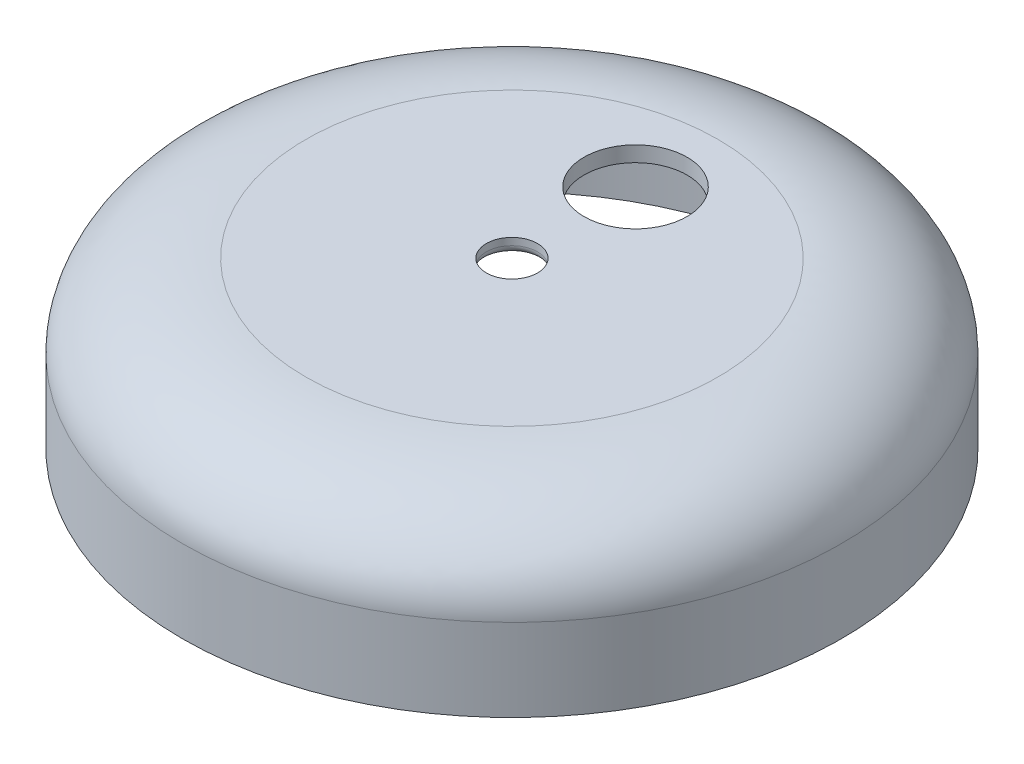
ISO-10303-21;
HEADER;
FILE_DESCRIPTION(('STEP AP214'),'2;1');
FILE_NAME('part.step','',(''),(''),'','','');
FILE_SCHEMA(('AUTOMOTIVE_DESIGN { 1 0 10303 214 1 1 1 1 }'));
ENDSEC;
DATA;
#1=APPLICATION_CONTEXT('core data for automotive mechanical design processes');
#2=APPLICATION_PROTOCOL_DEFINITION('international standard','automotive_design',2000,#1);
#3=PRODUCT_CONTEXT('',#1,'mechanical');
#4=PRODUCT('Part','Part','',(#3));
#5=PRODUCT_RELATED_PRODUCT_CATEGORY('part','',(#4));
#6=PRODUCT_DEFINITION_FORMATION('','',#4);
#7=PRODUCT_DEFINITION_CONTEXT('part definition',#1,'design');
#8=PRODUCT_DEFINITION('design','',#6,#7);
#9=PRODUCT_DEFINITION_SHAPE('','',#8);
#10=(LENGTH_UNIT() NAMED_UNIT(*) SI_UNIT(.MILLI.,.METRE.));
#11=(NAMED_UNIT(*) PLANE_ANGLE_UNIT() SI_UNIT($,.RADIAN.));
#12=(NAMED_UNIT(*) SI_UNIT($,.STERADIAN.) SOLID_ANGLE_UNIT());
#13=UNCERTAINTY_MEASURE_WITH_UNIT(LENGTH_MEASURE(1.E-05),#10,'distance_accuracy_value','');
#14=(GEOMETRIC_REPRESENTATION_CONTEXT(3) GLOBAL_UNCERTAINTY_ASSIGNED_CONTEXT((#13)) GLOBAL_UNIT_ASSIGNED_CONTEXT((#10,
#11,#12)) REPRESENTATION_CONTEXT('',''));
#15=CARTESIAN_POINT('',(0.,0.,0.));
#16=DIRECTION('',(0.,0.,1.));
#17=DIRECTION('',(1.,0.,0.));
#18=AXIS2_PLACEMENT_3D('',#15,#16,#17);
#19=CARTESIAN_POINT('',(0.,0.,0.));
#20=DIRECTION('',(0.,-1.,0.));
#21=DIRECTION('',(0.,0.,-1.));
#22=AXIS2_PLACEMENT_3D('',#19,#20,#21);
#23=PLANE('',#22);
#24=CARTESIAN_POINT('',(0.,0.,-38.1));
#25=DIRECTION('',(0.,1.,0.));
#26=DIRECTION('',(0.,0.,1.));
#27=AXIS2_PLACEMENT_3D('',#24,#25,#26);
#28=CIRCLE('',#27,15.875);
#29=CARTESIAN_POINT('',(0.,0.,-22.225));
#30=VERTEX_POINT('',#29);
#31=EDGE_CURVE('E52',#30,#30,#28,.T.);
#32=ORIENTED_EDGE('',*,*,#31,.F.);
#33=EDGE_LOOP('',(#32));
#34=FACE_BOUND('',#33,.T.);
#35=CARTESIAN_POINT('',(0.,0.,0.));
#36=DIRECTION('',(0.,1.,0.));
#37=DIRECTION('',(0.,0.,1.));
#38=AXIS2_PLACEMENT_3D('',#35,#36,#37);
#39=CIRCLE('',#38,7.874);
#40=CARTESIAN_POINT('',(0.,0.,7.874));
#41=VERTEX_POINT('',#40);
#42=EDGE_CURVE('E88',#41,#41,#39,.T.);
#43=ORIENTED_EDGE('',*,*,#42,.F.);
#44=EDGE_LOOP('',(#43));
#45=FACE_BOUND('',#44,.T.);
#46=CARTESIAN_POINT('',(0.,0.,0.));
#47=DIRECTION('',(0.,1.,0.));
#48=DIRECTION('',(0.,0.,1.));
#49=AXIS2_PLACEMENT_3D('',#46,#47,#48);
#50=CIRCLE('',#49,63.5);
#51=CARTESIAN_POINT('',(0.,0.,63.5));
#52=VERTEX_POINT('',#51);
#53=EDGE_CURVE('E42',#52,#52,#50,.T.);
#54=ORIENTED_EDGE('',*,*,#53,.T.);
#55=EDGE_LOOP('',(#54));
#56=FACE_BOUND('',#55,.T.);
#57=ADVANCED_FACE('F31',(#34,#45,#56),#23,.F.);
#58=CARTESIAN_POINT('',(63.5,-25.4,0.));
#59=DIRECTION('',(0.,0.,1.));
#60=DIRECTION('',(-1.,0.,0.));
#61=AXIS2_PLACEMENT_3D('',#58,#59,#60);
#62=ELLIPSE('',#61,38.1,25.4);
#63=CARTESIAN_POINT('',(0.,29.511089747257,0.));
#64=DIRECTION('',(0.,1.,0.));
#65=AXIS1_PLACEMENT('',#63,#64);
#66=SURFACE_OF_REVOLUTION('',#62,#65);
#67=ORIENTED_EDGE('',*,*,#53,.F.);
#68=EDGE_LOOP('',(#67));
#69=FACE_BOUND('',#68,.T.);
#70=CARTESIAN_POINT('',(0.,-25.4,0.));
#71=DIRECTION('',(0.,1.,0.));
#72=DIRECTION('',(0.,0.,1.));
#73=AXIS2_PLACEMENT_3D('',#70,#71,#72);
#74=CIRCLE('',#73,101.6);
#75=CARTESIAN_POINT('',(0.,-25.4,101.6));
#76=VERTEX_POINT('',#75);
#77=EDGE_CURVE('E46',#76,#76,#74,.T.);
#78=ORIENTED_EDGE('',*,*,#77,.T.);
#79=EDGE_LOOP('',(#78));
#80=FACE_BOUND('',#79,.T.);
#81=ADVANCED_FACE('F72',(#69,#80),#66,.T.);
#82=CARTESIAN_POINT('',(0.,29.511089747257,0.));
#83=DIRECTION('',(0.,1.,0.));
#84=DIRECTION('',(0.,0.,1.));
#85=AXIS2_PLACEMENT_3D('',#82,#83,#84);
#86=CYLINDRICAL_SURFACE('',#85,101.6);
#87=ORIENTED_EDGE('',*,*,#77,.F.);
#88=EDGE_LOOP('',(#87));
#89=FACE_BOUND('',#88,.T.);
#90=CARTESIAN_POINT('',(0.,-50.8,0.));
#91=DIRECTION('',(0.,1.,0.));
#92=DIRECTION('',(0.,0.,1.));
#93=AXIS2_PLACEMENT_3D('',#90,#91,#92);
#94=CIRCLE('',#93,101.6);
#95=CARTESIAN_POINT('',(0.,-50.8,101.6));
#96=VERTEX_POINT('',#95);
#97=EDGE_CURVE('E56',#96,#96,#94,.T.);
#98=ORIENTED_EDGE('',*,*,#97,.T.);
#99=EDGE_LOOP('',(#98));
#100=FACE_BOUND('',#99,.T.);
#101=ADVANCED_FACE('F75',(#89,#100),#86,.T.);
#102=CARTESIAN_POINT('',(96.8375,-50.8,0.));
#103=DIRECTION('',(0.,1.,0.));
#104=DIRECTION('',(0.,0.,1.));
#105=AXIS2_PLACEMENT_3D('',#102,#103,#104);
#106=PLANE('',#105);
#107=ORIENTED_EDGE('',*,*,#97,.F.);
#108=EDGE_LOOP('',(#107));
#109=FACE_BOUND('',#108,.T.);
#110=CARTESIAN_POINT('',(0.,-50.8,0.));
#111=DIRECTION('',(0.,1.,0.));
#112=DIRECTION('',(0.,0.,1.));
#113=AXIS2_PLACEMENT_3D('',#110,#111,#112);
#114=CIRCLE('',#113,96.8375);
#115=CARTESIAN_POINT('',(0.,-50.8,96.8375));
#116=VERTEX_POINT('',#115);
#117=EDGE_CURVE('E59',#116,#116,#114,.T.);
#118=ORIENTED_EDGE('',*,*,#117,.T.);
#119=EDGE_LOOP('',(#118));
#120=FACE_BOUND('',#119,.T.);
#121=ADVANCED_FACE('F95',(#109,#120),#106,.F.);
#122=CARTESIAN_POINT('',(0.,29.511089747257,0.));
#123=DIRECTION('',(0.,1.,0.));
#124=DIRECTION('',(0.,0.,1.));
#125=AXIS2_PLACEMENT_3D('',#122,#123,#124);
#126=CYLINDRICAL_SURFACE('',#125,96.8375);
#127=ORIENTED_EDGE('',*,*,#117,.F.);
#128=EDGE_LOOP('',(#127));
#129=FACE_BOUND('',#128,.T.);
#130=CARTESIAN_POINT('',(0.,-25.4,0.));
#131=DIRECTION('',(0.,1.,0.));
#132=DIRECTION('',(0.,0.,1.));
#133=AXIS2_PLACEMENT_3D('',#130,#131,#132);
#134=CIRCLE('',#133,96.8375);
#135=CARTESIAN_POINT('',(0.,-25.4,96.8375));
#136=VERTEX_POINT('',#135);
#137=EDGE_CURVE('E62',#136,#136,#134,.T.);
#138=ORIENTED_EDGE('',*,*,#137,.T.);
#139=EDGE_LOOP('',(#138));
#140=FACE_BOUND('',#139,.T.);
#141=ADVANCED_FACE('F100',(#129,#140),#126,.F.);
#142=CARTESIAN_POINT('',(63.5,-25.4,0.));
#143=DIRECTION('',(0.,0.,-1.));
#144=DIRECTION('',(1.,0.,0.));
#145=AXIS2_PLACEMENT_3D('',#142,#143,#144);
#146=ELLIPSE('',#145,33.3375,20.6375);
#147=CARTESIAN_POINT('',(0.,29.511089747257,0.));
#148=DIRECTION('',(0.,1.,0.));
#149=AXIS1_PLACEMENT('',#147,#148);
#150=SURFACE_OF_REVOLUTION('',#146,#149);
#151=ORIENTED_EDGE('',*,*,#137,.F.);
#152=EDGE_LOOP('',(#151));
#153=FACE_BOUND('',#152,.T.);
#154=CARTESIAN_POINT('',(0.,-4.7625,0.));
#155=DIRECTION('',(0.,1.,0.));
#156=DIRECTION('',(0.,0.,1.));
#157=AXIS2_PLACEMENT_3D('',#154,#155,#156);
#158=CIRCLE('',#157,63.5);
#159=CARTESIAN_POINT('',(0.,-4.7625,63.5));
#160=VERTEX_POINT('',#159);
#161=EDGE_CURVE('E51',#160,#160,#158,.T.);
#162=ORIENTED_EDGE('',*,*,#161,.T.);
#163=EDGE_LOOP('',(#162));
#164=FACE_BOUND('',#163,.T.);
#165=ADVANCED_FACE('F105',(#153,#164),#150,.T.);
#166=CARTESIAN_POINT('',(0.,-4.7625,0.));
#167=DIRECTION('',(0.,1.,0.));
#168=DIRECTION('',(0.,0.,1.));
#169=AXIS2_PLACEMENT_3D('',#166,#167,#168);
#170=PLANE('',#169);
#171=CARTESIAN_POINT('',(0.,-4.7625,0.));
#172=DIRECTION('',(0.,1.,0.));
#173=DIRECTION('',(0.,0.,1.));
#174=AXIS2_PLACEMENT_3D('',#171,#172,#173);
#175=CIRCLE('',#174,10.414);
#176=CARTESIAN_POINT('',(0.,-4.7625,10.414));
#177=VERTEX_POINT('',#176);
#178=EDGE_CURVE('E38',#177,#177,#175,.T.);
#179=ORIENTED_EDGE('',*,*,#178,.T.);
#180=EDGE_LOOP('',(#179));
#181=FACE_BOUND('',#180,.T.);
#182=CARTESIAN_POINT('',(0.,-4.7625,-38.1));
#183=DIRECTION('',(0.,1.,0.));
#184=DIRECTION('',(0.,0.,1.));
#185=AXIS2_PLACEMENT_3D('',#182,#183,#184);
#186=CIRCLE('',#185,15.875);
#187=CARTESIAN_POINT('',(0.,-4.7625,-22.225));
#188=VERTEX_POINT('',#187);
#189=EDGE_CURVE('E49',#188,#188,#186,.T.);
#190=ORIENTED_EDGE('',*,*,#189,.T.);
#191=EDGE_LOOP('',(#190));
#192=FACE_BOUND('',#191,.T.);
#193=ORIENTED_EDGE('',*,*,#161,.F.);
#194=EDGE_LOOP('',(#193));
#195=FACE_BOUND('',#194,.T.);
#196=ADVANCED_FACE('F111',(#181,#192,#195),#170,.F.);
#197=CARTESIAN_POINT('',(0.,-25.4,0.));
#198=DIRECTION('',(0.,1.,0.));
#199=DIRECTION('',(0.,0.,1.));
#200=AXIS2_PLACEMENT_3D('',#197,#198,#199);
#201=CYLINDRICAL_SURFACE('',#200,7.874);
#202=CARTESIAN_POINT('',(0.,-2.2225,0.));
#203=DIRECTION('',(0.,1.,0.));
#204=DIRECTION('',(0.,0.,1.));
#205=AXIS2_PLACEMENT_3D('',#202,#203,#204);
#206=CIRCLE('',#205,7.874);
#207=CARTESIAN_POINT('',(0.,-2.2225,7.874));
#208=VERTEX_POINT('',#207);
#209=EDGE_CURVE('E10',#208,#208,#206,.F.);
#210=ORIENTED_EDGE('',*,*,#209,.T.);
#211=EDGE_LOOP('',(#210));
#212=FACE_BOUND('',#211,.T.);
#213=ORIENTED_EDGE('',*,*,#42,.T.);
#214=EDGE_LOOP('',(#213));
#215=FACE_BOUND('',#214,.T.);
#216=ADVANCED_FACE('F116',(#212,#215),#201,.F.);
#217=CARTESIAN_POINT('',(0.,-25.4,-38.1));
#218=DIRECTION('',(0.,1.,0.));
#219=DIRECTION('',(0.,0.,1.));
#220=AXIS2_PLACEMENT_3D('',#217,#218,#219);
#221=CYLINDRICAL_SURFACE('',#220,15.875);
#222=ORIENTED_EDGE('',*,*,#31,.T.);
#223=EDGE_LOOP('',(#222));
#224=FACE_BOUND('',#223,.T.);
#225=ORIENTED_EDGE('',*,*,#189,.F.);
#226=EDGE_LOOP('',(#225));
#227=FACE_BOUND('',#226,.T.);
#228=ADVANCED_FACE('F121',(#224,#227),#221,.F.);
#229=CARTESIAN_POINT('',(0.,-2.2225,0.));
#230=DIRECTION('',(0.,1.,0.));
#231=DIRECTION('',(0.,0.,1.));
#232=AXIS2_PLACEMENT_3D('',#229,#230,#231);
#233=TOROIDAL_SURFACE('',#232,10.414,2.54);
#234=ORIENTED_EDGE('',*,*,#209,.F.);
#235=EDGE_LOOP('',(#234));
#236=FACE_BOUND('',#235,.T.);
#237=ORIENTED_EDGE('',*,*,#178,.F.);
#238=EDGE_LOOP('',(#237));
#239=FACE_BOUND('',#238,.T.);
#240=ADVANCED_FACE('F33',(#236,#239),#233,.T.);
#241=CLOSED_SHELL('',(#57,#81,#101,#121,#141,#165,#196,#216,#228,#240));
#242=MANIFOLD_SOLID_BREP('B2',#241);
#243=ADVANCED_BREP_SHAPE_REPRESENTATION('',(#18,#242),#14);
#244=SHAPE_DEFINITION_REPRESENTATION(#9,#243);
ENDSEC;
END-ISO-10303-21;
